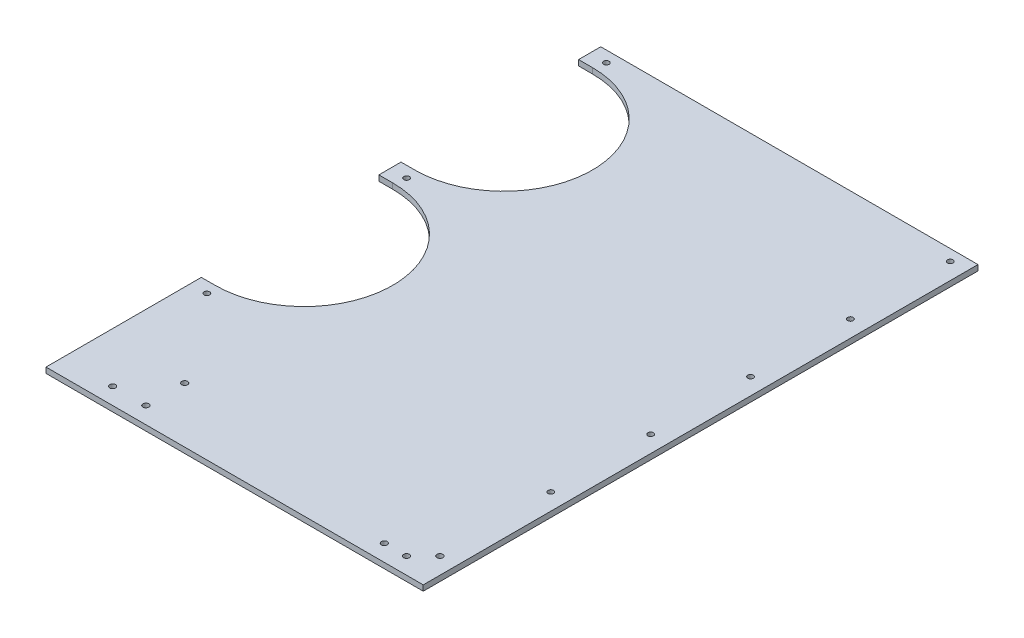
ISO-10303-21;
HEADER;
FILE_DESCRIPTION(('STEP AP214'),'2;1');
FILE_NAME('part.step','',(''),(''),'','','');
FILE_SCHEMA(('AUTOMOTIVE_DESIGN { 1 0 10303 214 1 1 1 1 }'));
ENDSEC;
DATA;
#1=APPLICATION_CONTEXT('core data for automotive mechanical design processes');
#2=APPLICATION_PROTOCOL_DEFINITION('international standard','automotive_design',2000,#1);
#3=PRODUCT_CONTEXT('',#1,'mechanical');
#4=PRODUCT('Part','Part','',(#3));
#5=PRODUCT_RELATED_PRODUCT_CATEGORY('part','',(#4));
#6=PRODUCT_DEFINITION_FORMATION('','',#4);
#7=PRODUCT_DEFINITION_CONTEXT('part definition',#1,'design');
#8=PRODUCT_DEFINITION('design','',#6,#7);
#9=PRODUCT_DEFINITION_SHAPE('','',#8);
#10=(LENGTH_UNIT() NAMED_UNIT(*) SI_UNIT(.MILLI.,.METRE.));
#11=(NAMED_UNIT(*) PLANE_ANGLE_UNIT() SI_UNIT($,.RADIAN.));
#12=(NAMED_UNIT(*) SI_UNIT($,.STERADIAN.) SOLID_ANGLE_UNIT());
#13=UNCERTAINTY_MEASURE_WITH_UNIT(LENGTH_MEASURE(1.E-05),#10,'distance_accuracy_value','');
#14=(GEOMETRIC_REPRESENTATION_CONTEXT(3) GLOBAL_UNCERTAINTY_ASSIGNED_CONTEXT((#13)) GLOBAL_UNIT_ASSIGNED_CONTEXT((#10,
#11,#12)) REPRESENTATION_CONTEXT('',''));
#15=CARTESIAN_POINT('',(0.,0.,0.));
#16=DIRECTION('',(0.,0.,1.));
#17=DIRECTION('',(1.,0.,0.));
#18=AXIS2_PLACEMENT_3D('',#15,#16,#17);
#19=CARTESIAN_POINT('',(-120.649999995191,-761.580050525437,374.650000000872));
#20=DIRECTION('',(0.,1.,0.));
#21=DIRECTION('',(1.,0.,0.));
#22=AXIS2_PLACEMENT_3D('',#19,#20,#21);
#23=CYLINDRICAL_SURFACE('',#22,3.3782);
#24=CARTESIAN_POINT('',(-120.649999995191,0.,374.650000000872));
#25=DIRECTION('',(0.,1.,0.));
#26=DIRECTION('',(1.,0.,0.));
#27=AXIS2_PLACEMENT_3D('',#24,#25,#26);
#28=CIRCLE('',#27,3.3782);
#29=CARTESIAN_POINT('',(-117.271799995191,0.,374.650000000872));
#30=VERTEX_POINT('',#29);
#31=EDGE_CURVE('E273',#30,#30,#28,.T.);
#32=ORIENTED_EDGE('',*,*,#31,.F.);
#33=EDGE_LOOP('',(#32));
#34=FACE_BOUND('',#33,.T.);
#35=CARTESIAN_POINT('',(-120.649999995191,6.35000000000005,374.650000000872));
#36=DIRECTION('',(0.,-1.,0.));
#37=DIRECTION('',(0.,0.,-1.));
#38=AXIS2_PLACEMENT_3D('',#35,#36,#37);
#39=CIRCLE('',#38,3.3782);
#40=CARTESIAN_POINT('',(-120.649999995191,6.35000000000005,371.271800000872));
#41=VERTEX_POINT('',#40);
#42=EDGE_CURVE('E209',#41,#41,#39,.T.);
#43=ORIENTED_EDGE('',*,*,#42,.F.);
#44=EDGE_LOOP('',(#43));
#45=FACE_BOUND('',#44,.T.);
#46=ADVANCED_FACE('F16',(#34,#45),#23,.F.);
#47=CARTESIAN_POINT('',(-120.649999995512,-761.580050525437,330.200000000874));
#48=DIRECTION('',(0.,1.,0.));
#49=DIRECTION('',(1.,0.,0.));
#50=AXIS2_PLACEMENT_3D('',#47,#48,#49);
#51=CYLINDRICAL_SURFACE('',#50,3.3782);
#52=CARTESIAN_POINT('',(-120.649999995512,0.,330.200000000874));
#53=DIRECTION('',(0.,1.,0.));
#54=DIRECTION('',(1.,0.,0.));
#55=AXIS2_PLACEMENT_3D('',#52,#53,#54);
#56=CIRCLE('',#55,3.3782);
#57=CARTESIAN_POINT('',(-117.271799995512,0.,330.200000000874));
#58=VERTEX_POINT('',#57);
#59=EDGE_CURVE('E531',#58,#58,#56,.T.);
#60=ORIENTED_EDGE('',*,*,#59,.F.);
#61=EDGE_LOOP('',(#60));
#62=FACE_BOUND('',#61,.T.);
#63=CARTESIAN_POINT('',(-120.649999995512,6.35000000000005,330.200000000874));
#64=DIRECTION('',(0.,-1.,0.));
#65=DIRECTION('',(0.,0.,-1.));
#66=AXIS2_PLACEMENT_3D('',#63,#64,#65);
#67=CIRCLE('',#66,3.3782);
#68=CARTESIAN_POINT('',(-120.649999995512,6.35000000000005,326.821800000874));
#69=VERTEX_POINT('',#68);
#70=EDGE_CURVE('E499',#69,#69,#67,.T.);
#71=ORIENTED_EDGE('',*,*,#70,.F.);
#72=EDGE_LOOP('',(#71));
#73=FACE_BOUND('',#72,.T.);
#74=ADVANCED_FACE('F297',(#62,#73),#51,.F.);
#75=CARTESIAN_POINT('',(-158.749999995189,-761.580050525437,374.650000001147));
#76=DIRECTION('',(0.,1.,0.));
#77=DIRECTION('',(1.,0.,0.));
#78=AXIS2_PLACEMENT_3D('',#75,#76,#77);
#79=CYLINDRICAL_SURFACE('',#78,3.3782);
#80=CARTESIAN_POINT('',(-158.749999995189,0.,374.650000001147));
#81=DIRECTION('',(0.,1.,0.));
#82=DIRECTION('',(1.,0.,0.));
#83=AXIS2_PLACEMENT_3D('',#80,#81,#82);
#84=CIRCLE('',#83,3.3782);
#85=CARTESIAN_POINT('',(-155.371799995189,0.,374.650000001147));
#86=VERTEX_POINT('',#85);
#87=EDGE_CURVE('E527',#86,#86,#84,.T.);
#88=ORIENTED_EDGE('',*,*,#87,.F.);
#89=EDGE_LOOP('',(#88));
#90=FACE_BOUND('',#89,.T.);
#91=CARTESIAN_POINT('',(-158.749999995189,6.35000000000005,374.650000001147));
#92=DIRECTION('',(0.,-1.,0.));
#93=DIRECTION('',(0.,0.,-1.));
#94=AXIS2_PLACEMENT_3D('',#91,#92,#93);
#95=CIRCLE('',#94,3.3782);
#96=CARTESIAN_POINT('',(-158.749999995189,6.35000000000005,371.271800001147));
#97=VERTEX_POINT('',#96);
#98=EDGE_CURVE('E503',#97,#97,#95,.T.);
#99=ORIENTED_EDGE('',*,*,#98,.F.);
#100=EDGE_LOOP('',(#99));
#101=FACE_BOUND('',#100,.T.);
#102=ADVANCED_FACE('F303',(#90,#101),#79,.F.);
#103=CARTESIAN_POINT('',(196.850000004656,-761.580050525437,355.599999998581));
#104=DIRECTION('',(0.,1.,0.));
#105=DIRECTION('',(1.,0.,0.));
#106=AXIS2_PLACEMENT_3D('',#103,#104,#105);
#107=CYLINDRICAL_SURFACE('',#106,3.3782);
#108=CARTESIAN_POINT('',(196.850000004656,0.,355.599999998581));
#109=DIRECTION('',(0.,1.,0.));
#110=DIRECTION('',(1.,0.,0.));
#111=AXIS2_PLACEMENT_3D('',#108,#109,#110);
#112=CIRCLE('',#111,3.3782);
#113=CARTESIAN_POINT('',(200.228200004656,0.,355.599999998581));
#114=VERTEX_POINT('',#113);
#115=EDGE_CURVE('E523',#114,#114,#112,.T.);
#116=ORIENTED_EDGE('',*,*,#115,.F.);
#117=EDGE_LOOP('',(#116));
#118=FACE_BOUND('',#117,.T.);
#119=CARTESIAN_POINT('',(196.850000004656,6.35000000000005,355.599999998581));
#120=DIRECTION('',(0.,-1.,0.));
#121=DIRECTION('',(0.,0.,-1.));
#122=AXIS2_PLACEMENT_3D('',#119,#120,#121);
#123=CIRCLE('',#122,3.3782);
#124=CARTESIAN_POINT('',(196.850000004656,6.35000000000005,352.221799998581));
#125=VERTEX_POINT('',#124);
#126=EDGE_CURVE('E507',#125,#125,#123,.T.);
#127=ORIENTED_EDGE('',*,*,#126,.F.);
#128=EDGE_LOOP('',(#127));
#129=FACE_BOUND('',#128,.T.);
#130=ADVANCED_FACE('F311',(#118,#129),#107,.F.);
#131=CARTESIAN_POINT('',(177.800000004794,-761.580050525437,374.649999998718));
#132=DIRECTION('',(0.,1.,0.));
#133=DIRECTION('',(1.,0.,0.));
#134=AXIS2_PLACEMENT_3D('',#131,#132,#133);
#135=CYLINDRICAL_SURFACE('',#134,3.3782);
#136=CARTESIAN_POINT('',(177.800000004794,0.,374.649999998718));
#137=DIRECTION('',(0.,1.,0.));
#138=DIRECTION('',(1.,0.,0.));
#139=AXIS2_PLACEMENT_3D('',#136,#137,#138);
#140=CIRCLE('',#139,3.3782);
#141=CARTESIAN_POINT('',(181.178200004794,0.,374.649999998718));
#142=VERTEX_POINT('',#141);
#143=EDGE_CURVE('E519',#142,#142,#140,.T.);
#144=ORIENTED_EDGE('',*,*,#143,.F.);
#145=EDGE_LOOP('',(#144));
#146=FACE_BOUND('',#145,.T.);
#147=CARTESIAN_POINT('',(177.800000004794,6.35000000000005,374.649999998718));
#148=DIRECTION('',(0.,-1.,0.));
#149=DIRECTION('',(0.,0.,-1.));
#150=AXIS2_PLACEMENT_3D('',#147,#148,#149);
#151=CIRCLE('',#150,3.3782);
#152=CARTESIAN_POINT('',(177.800000004794,6.35000000000005,371.271799998718));
#153=VERTEX_POINT('',#152);
#154=EDGE_CURVE('E511',#153,#153,#151,.T.);
#155=ORIENTED_EDGE('',*,*,#154,.F.);
#156=EDGE_LOOP('',(#155));
#157=FACE_BOUND('',#156,.T.);
#158=ADVANCED_FACE('F315',(#146,#157),#135,.F.);
#159=CARTESIAN_POINT('',(152.400000004795,-761.580050525437,374.649999998901));
#160=DIRECTION('',(0.,1.,0.));
#161=DIRECTION('',(1.,0.,0.));
#162=AXIS2_PLACEMENT_3D('',#159,#160,#161);
#163=CYLINDRICAL_SURFACE('',#162,3.3782);
#164=CARTESIAN_POINT('',(152.400000004795,0.,374.649999998901));
#165=DIRECTION('',(0.,1.,0.));
#166=DIRECTION('',(1.,0.,0.));
#167=AXIS2_PLACEMENT_3D('',#164,#165,#166);
#168=CIRCLE('',#167,3.3782);
#169=CARTESIAN_POINT('',(155.778200004795,0.,374.649999998901));
#170=VERTEX_POINT('',#169);
#171=EDGE_CURVE('E281',#170,#170,#168,.T.);
#172=ORIENTED_EDGE('',*,*,#171,.F.);
#173=EDGE_LOOP('',(#172));
#174=FACE_BOUND('',#173,.T.);
#175=CARTESIAN_POINT('',(152.400000004795,6.35000000000005,374.649999998901));
#176=DIRECTION('',(0.,-1.,0.));
#177=DIRECTION('',(0.,0.,-1.));
#178=AXIS2_PLACEMENT_3D('',#175,#176,#177);
#179=CIRCLE('',#178,3.3782);
#180=CARTESIAN_POINT('',(152.400000004795,6.35000000000005,371.271799998901));
#181=VERTEX_POINT('',#180);
#182=EDGE_CURVE('E244',#181,#181,#179,.T.);
#183=ORIENTED_EDGE('',*,*,#182,.F.);
#184=EDGE_LOOP('',(#183));
#185=FACE_BOUND('',#184,.T.);
#186=ADVANCED_FACE('F319',(#174,#185),#163,.F.);
#187=CARTESIAN_POINT('',(0.,3.175,393.7));
#188=DIRECTION('',(0.,0.,1.));
#189=DIRECTION('',(1.,0.,0.));
#190=AXIS2_PLACEMENT_3D('',#187,#188,#189);
#191=PLANE('',#190);
#192=DIRECTION('',(-1.,0.,0.));
#193=VECTOR('',#192,1.);
#194=CARTESIAN_POINT('',(215.9,6.35,393.7));
#195=LINE('',#194,#193);
#196=CARTESIAN_POINT('',(215.9,6.35,393.7));
#197=VERTEX_POINT('',#196);
#198=CARTESIAN_POINT('',(-215.9,6.35,393.7));
#199=VERTEX_POINT('',#198);
#200=EDGE_CURVE('E11',#197,#199,#195,.T.);
#201=ORIENTED_EDGE('',*,*,#200,.T.);
#202=DIRECTION('',(0.,-1.,0.));
#203=VECTOR('',#202,1.);
#204=CARTESIAN_POINT('',(-215.9,6.35,393.7));
#205=LINE('',#204,#203);
#206=CARTESIAN_POINT('',(-215.9,0.,393.7));
#207=VERTEX_POINT('',#206);
#208=EDGE_CURVE('E26',#199,#207,#205,.T.);
#209=ORIENTED_EDGE('',*,*,#208,.T.);
#210=DIRECTION('',(1.,0.,0.));
#211=VECTOR('',#210,1.);
#212=CARTESIAN_POINT('',(-215.9,0.,393.7));
#213=LINE('',#212,#211);
#214=CARTESIAN_POINT('',(215.9,0.,393.7));
#215=VERTEX_POINT('',#214);
#216=EDGE_CURVE('E267',#207,#215,#213,.T.);
#217=ORIENTED_EDGE('',*,*,#216,.T.);
#218=DIRECTION('',(0.,1.,0.));
#219=VECTOR('',#218,1.);
#220=CARTESIAN_POINT('',(215.9,0.,393.7));
#221=LINE('',#220,#219);
#222=EDGE_CURVE('E271',#215,#197,#221,.T.);
#223=ORIENTED_EDGE('',*,*,#222,.T.);
#224=EDGE_LOOP('',(#201,#209,#217,#223));
#225=FACE_BOUND('',#224,.T.);
#226=ADVANCED_FACE('F275',(#225),#191,.T.);
#227=CARTESIAN_POINT('',(0.,0.,0.));
#228=DIRECTION('',(0.,1.,0.));
#229=DIRECTION('',(0.,0.,1.));
#230=AXIS2_PLACEMENT_3D('',#227,#228,#229);
#231=PLANE('',#230);
#232=ORIENTED_EDGE('',*,*,#31,.T.);
#233=EDGE_LOOP('',(#232));
#234=FACE_BOUND('',#233,.T.);
#235=ORIENTED_EDGE('',*,*,#59,.T.);
#236=EDGE_LOOP('',(#235));
#237=FACE_BOUND('',#236,.T.);
#238=ORIENTED_EDGE('',*,*,#87,.T.);
#239=EDGE_LOOP('',(#238));
#240=FACE_BOUND('',#239,.T.);
#241=ORIENTED_EDGE('',*,*,#115,.T.);
#242=EDGE_LOOP('',(#241));
#243=FACE_BOUND('',#242,.T.);
#244=ORIENTED_EDGE('',*,*,#143,.T.);
#245=EDGE_LOOP('',(#244));
#246=FACE_BOUND('',#245,.T.);
#247=ORIENTED_EDGE('',*,*,#171,.T.);
#248=EDGE_LOOP('',(#247));
#249=FACE_BOUND('',#248,.T.);
#250=DIRECTION('',(0.,0.,-1.));
#251=VECTOR('',#250,1.);
#252=CARTESIAN_POINT('',(-215.9,0.,279.4));
#253=LINE('',#252,#251);
#254=CARTESIAN_POINT('',(-215.9,0.,215.9));
#255=VERTEX_POINT('',#254);
#256=EDGE_CURVE('E279',#207,#255,#253,.T.);
#257=ORIENTED_EDGE('',*,*,#256,.T.);
#258=DIRECTION('',(1.,0.,0.));
#259=VECTOR('',#258,1.);
#260=CARTESIAN_POINT('',(-100.0125,0.,215.9));
#261=LINE('',#260,#259);
#262=CARTESIAN_POINT('',(-200.025,0.,215.9));
#263=VERTEX_POINT('',#262);
#264=EDGE_CURVE('E282',#255,#263,#261,.T.);
#265=ORIENTED_EDGE('',*,*,#264,.T.);
#266=CARTESIAN_POINT('',(-200.025,0.,114.3));
#267=DIRECTION('',(0.,1.,0.));
#268=DIRECTION('',(1.,0.,0.));
#269=AXIS2_PLACEMENT_3D('',#266,#267,#268);
#270=CIRCLE('',#269,101.6);
#271=CARTESIAN_POINT('',(-200.025,0.,12.7));
#272=VERTEX_POINT('',#271);
#273=EDGE_CURVE('E126',#263,#272,#270,.T.);
#274=ORIENTED_EDGE('',*,*,#273,.T.);
#275=DIRECTION('',(-1.,0.,0.));
#276=VECTOR('',#275,1.);
#277=CARTESIAN_POINT('',(-107.95,0.,12.7));
#278=LINE('',#277,#276);
#279=CARTESIAN_POINT('',(-215.9,0.,12.7));
#280=VERTEX_POINT('',#279);
#281=EDGE_CURVE('E168',#272,#280,#278,.T.);
#282=ORIENTED_EDGE('',*,*,#281,.T.);
#283=DIRECTION('',(0.,0.,-1.));
#284=VECTOR('',#283,1.);
#285=CARTESIAN_POINT('',(-215.9,0.,279.4));
#286=LINE('',#285,#284);
#287=CARTESIAN_POINT('',(-215.9,0.,-12.7));
#288=VERTEX_POINT('',#287);
#289=EDGE_CURVE('E165',#280,#288,#286,.T.);
#290=ORIENTED_EDGE('',*,*,#289,.T.);
#291=DIRECTION('',(1.,0.,0.));
#292=VECTOR('',#291,1.);
#293=CARTESIAN_POINT('',(-100.0125,0.,-12.7));
#294=LINE('',#293,#292);
#295=CARTESIAN_POINT('',(-200.025,0.,-12.7));
#296=VERTEX_POINT('',#295);
#297=EDGE_CURVE('E146',#288,#296,#294,.T.);
#298=ORIENTED_EDGE('',*,*,#297,.T.);
#299=CARTESIAN_POINT('',(-200.025,0.,-114.3));
#300=DIRECTION('',(0.,1.,0.));
#301=DIRECTION('',(1.,0.,0.));
#302=AXIS2_PLACEMENT_3D('',#299,#300,#301);
#303=CIRCLE('',#302,101.6);
#304=CARTESIAN_POINT('',(-200.025,0.,-215.9));
#305=VERTEX_POINT('',#304);
#306=EDGE_CURVE('E155',#296,#305,#303,.T.);
#307=ORIENTED_EDGE('',*,*,#306,.T.);
#308=DIRECTION('',(-1.,0.,0.));
#309=VECTOR('',#308,1.);
#310=CARTESIAN_POINT('',(-107.95,0.,-215.9));
#311=LINE('',#310,#309);
#312=CARTESIAN_POINT('',(-215.9,0.,-215.9));
#313=VERTEX_POINT('',#312);
#314=EDGE_CURVE('E159',#305,#313,#311,.T.);
#315=ORIENTED_EDGE('',*,*,#314,.T.);
#316=DIRECTION('',(0.,0.,-1.));
#317=VECTOR('',#316,1.);
#318=CARTESIAN_POINT('',(-215.9,0.,279.4));
#319=LINE('',#318,#317);
#320=CARTESIAN_POINT('',(-215.9,0.,-241.3));
#321=VERTEX_POINT('',#320);
#322=EDGE_CURVE('E173',#313,#321,#319,.T.);
#323=ORIENTED_EDGE('',*,*,#322,.T.);
#324=DIRECTION('',(1.,0.,0.));
#325=VECTOR('',#324,1.);
#326=CARTESIAN_POINT('',(107.95,0.,-241.3));
#327=LINE('',#326,#325);
#328=CARTESIAN_POINT('',(215.9,0.,-241.3));
#329=VERTEX_POINT('',#328);
#330=EDGE_CURVE('E176',#321,#329,#327,.T.);
#331=ORIENTED_EDGE('',*,*,#330,.T.);
#332=DIRECTION('',(0.,0.,1.));
#333=VECTOR('',#332,1.);
#334=CARTESIAN_POINT('',(215.9,0.,-279.4));
#335=LINE('',#334,#333);
#336=EDGE_CURVE('E179',#329,#215,#335,.T.);
#337=ORIENTED_EDGE('',*,*,#336,.T.);
#338=ORIENTED_EDGE('',*,*,#216,.F.);
#339=EDGE_LOOP('',(#257,#265,#274,#282,#290,#298,#307,#315,#323,#331,#337,#338));
#340=FACE_BOUND('',#339,.T.);
#341=CARTESIAN_POINT('',(-196.85,0.,-228.6));
#342=DIRECTION('',(0.,1.,0.));
#343=DIRECTION('',(1.,0.,0.));
#344=AXIS2_PLACEMENT_3D('',#341,#342,#343);
#345=CIRCLE('',#344,3.175);
#346=CARTESIAN_POINT('',(-193.675,0.,-228.6));
#347=VERTEX_POINT('',#346);
#348=EDGE_CURVE('E182',#347,#347,#345,.T.);
#349=ORIENTED_EDGE('',*,*,#348,.T.);
#350=EDGE_LOOP('',(#349));
#351=FACE_BOUND('',#350,.T.);
#352=CARTESIAN_POINT('',(-196.85,0.,228.6));
#353=DIRECTION('',(0.,1.,0.));
#354=DIRECTION('',(1.,0.,0.));
#355=AXIS2_PLACEMENT_3D('',#352,#353,#354);
#356=CIRCLE('',#355,3.175);
#357=CARTESIAN_POINT('',(-193.675,0.,228.6));
#358=VERTEX_POINT('',#357);
#359=EDGE_CURVE('E185',#358,#358,#356,.T.);
#360=ORIENTED_EDGE('',*,*,#359,.T.);
#361=EDGE_LOOP('',(#360));
#362=FACE_BOUND('',#361,.T.);
#363=CARTESIAN_POINT('',(-196.85,0.,0.));
#364=DIRECTION('',(0.,1.,0.));
#365=DIRECTION('',(1.,0.,0.));
#366=AXIS2_PLACEMENT_3D('',#363,#364,#365);
#367=CIRCLE('',#366,3.175);
#368=CARTESIAN_POINT('',(-193.675,0.,0.));
#369=VERTEX_POINT('',#368);
#370=EDGE_CURVE('E188',#369,#369,#367,.T.);
#371=ORIENTED_EDGE('',*,*,#370,.T.);
#372=EDGE_LOOP('',(#371));
#373=FACE_BOUND('',#372,.T.);
#374=CARTESIAN_POINT('',(196.85,0.,-114.3));
#375=DIRECTION('',(0.,1.,0.));
#376=DIRECTION('',(1.,0.,0.));
#377=AXIS2_PLACEMENT_3D('',#374,#375,#376);
#378=CIRCLE('',#377,3.175);
#379=CARTESIAN_POINT('',(200.025,0.,-114.3));
#380=VERTEX_POINT('',#379);
#381=EDGE_CURVE('E191',#380,#380,#378,.T.);
#382=ORIENTED_EDGE('',*,*,#381,.T.);
#383=EDGE_LOOP('',(#382));
#384=FACE_BOUND('',#383,.T.);
#385=CARTESIAN_POINT('',(196.85,0.,228.6));
#386=DIRECTION('',(0.,1.,0.));
#387=DIRECTION('',(1.,0.,0.));
#388=AXIS2_PLACEMENT_3D('',#385,#386,#387);
#389=CIRCLE('',#388,3.175);
#390=CARTESIAN_POINT('',(200.025,0.,228.6));
#391=VERTEX_POINT('',#390);
#392=EDGE_CURVE('E194',#391,#391,#389,.T.);
#393=ORIENTED_EDGE('',*,*,#392,.T.);
#394=EDGE_LOOP('',(#393));
#395=FACE_BOUND('',#394,.T.);
#396=CARTESIAN_POINT('',(196.85,0.,-228.6));
#397=DIRECTION('',(0.,1.,0.));
#398=DIRECTION('',(1.,0.,0.));
#399=AXIS2_PLACEMENT_3D('',#396,#397,#398);
#400=CIRCLE('',#399,3.175);
#401=CARTESIAN_POINT('',(200.025,0.,-228.6));
#402=VERTEX_POINT('',#401);
#403=EDGE_CURVE('E197',#402,#402,#400,.T.);
#404=ORIENTED_EDGE('',*,*,#403,.T.);
#405=EDGE_LOOP('',(#404));
#406=FACE_BOUND('',#405,.T.);
#407=CARTESIAN_POINT('',(196.85,0.,0.));
#408=DIRECTION('',(0.,1.,0.));
#409=DIRECTION('',(1.,0.,0.));
#410=AXIS2_PLACEMENT_3D('',#407,#408,#409);
#411=CIRCLE('',#410,3.175);
#412=CARTESIAN_POINT('',(200.025,0.,0.));
#413=VERTEX_POINT('',#412);
#414=EDGE_CURVE('E200',#413,#413,#411,.T.);
#415=ORIENTED_EDGE('',*,*,#414,.T.);
#416=EDGE_LOOP('',(#415));
#417=FACE_BOUND('',#416,.T.);
#418=CARTESIAN_POINT('',(196.85,0.,114.3));
#419=DIRECTION('',(0.,1.,0.));
#420=DIRECTION('',(1.,0.,0.));
#421=AXIS2_PLACEMENT_3D('',#418,#419,#420);
#422=CIRCLE('',#421,3.175);
#423=CARTESIAN_POINT('',(200.025,0.,114.3));
#424=VERTEX_POINT('',#423);
#425=EDGE_CURVE('E203',#424,#424,#422,.T.);
#426=ORIENTED_EDGE('',*,*,#425,.T.);
#427=EDGE_LOOP('',(#426));
#428=FACE_BOUND('',#427,.T.);
#429=ADVANCED_FACE('F162',(#234,#237,#240,#243,#246,#249,#340,#351,#362,#373,#384,#395,#406,
#417,#428),#231,.F.);
#430=CARTESIAN_POINT('',(-215.9,0.,-279.4));
#431=DIRECTION('',(-1.,0.,0.));
#432=DIRECTION('',(0.,0.,1.));
#433=AXIS2_PLACEMENT_3D('',#430,#431,#432);
#434=PLANE('',#433);
#435=DIRECTION('',(0.,0.,1.));
#436=VECTOR('',#435,1.);
#437=CARTESIAN_POINT('',(-215.9,6.35,368.3));
#438=LINE('',#437,#436);
#439=CARTESIAN_POINT('',(-215.9,6.35,215.9));
#440=VERTEX_POINT('',#439);
#441=EDGE_CURVE('E115',#440,#199,#438,.T.);
#442=ORIENTED_EDGE('',*,*,#441,.F.);
#443=DIRECTION('',(0.,-1.,0.));
#444=VECTOR('',#443,1.);
#445=CARTESIAN_POINT('',(-215.9,3.175,215.9));
#446=LINE('',#445,#444);
#447=EDGE_CURVE('E112',#440,#255,#446,.T.);
#448=ORIENTED_EDGE('',*,*,#447,.T.);
#449=ORIENTED_EDGE('',*,*,#256,.F.);
#450=ORIENTED_EDGE('',*,*,#208,.F.);
#451=EDGE_LOOP('',(#442,#448,#449,#450));
#452=FACE_BOUND('',#451,.T.);
#453=ADVANCED_FACE('F328',(#452),#434,.T.);
#454=CARTESIAN_POINT('',(196.85,-641.256610914373,114.3));
#455=DIRECTION('',(0.,1.,0.));
#456=DIRECTION('',(1.,0.,0.));
#457=AXIS2_PLACEMENT_3D('',#454,#455,#456);
#458=CYLINDRICAL_SURFACE('',#457,3.175);
#459=ORIENTED_EDGE('',*,*,#425,.F.);
#460=EDGE_LOOP('',(#459));
#461=FACE_BOUND('',#460,.T.);
#462=CARTESIAN_POINT('',(196.85,6.35000000000005,114.3));
#463=DIRECTION('',(0.,-1.,0.));
#464=DIRECTION('',(0.,0.,-1.));
#465=AXIS2_PLACEMENT_3D('',#462,#463,#464);
#466=CIRCLE('',#465,3.175);
#467=CARTESIAN_POINT('',(196.85,6.35000000000005,111.125));
#468=VERTEX_POINT('',#467);
#469=EDGE_CURVE('E207',#468,#468,#466,.T.);
#470=ORIENTED_EDGE('',*,*,#469,.F.);
#471=EDGE_LOOP('',(#470));
#472=FACE_BOUND('',#471,.T.);
#473=ADVANCED_FACE('F332',(#461,#472),#458,.F.);
#474=CARTESIAN_POINT('',(196.85,-641.256610914373,0.));
#475=DIRECTION('',(0.,1.,0.));
#476=DIRECTION('',(1.,0.,0.));
#477=AXIS2_PLACEMENT_3D('',#474,#475,#476);
#478=CYLINDRICAL_SURFACE('',#477,3.175);
#479=ORIENTED_EDGE('',*,*,#414,.F.);
#480=EDGE_LOOP('',(#479));
#481=FACE_BOUND('',#480,.T.);
#482=CARTESIAN_POINT('',(196.85,6.35000000000005,0.));
#483=DIRECTION('',(0.,-1.,0.));
#484=DIRECTION('',(0.,0.,-1.));
#485=AXIS2_PLACEMENT_3D('',#482,#483,#484);
#486=CIRCLE('',#485,3.175);
#487=CARTESIAN_POINT('',(196.85,6.35000000000005,-3.175));
#488=VERTEX_POINT('',#487);
#489=EDGE_CURVE('E212',#488,#488,#486,.T.);
#490=ORIENTED_EDGE('',*,*,#489,.F.);
#491=EDGE_LOOP('',(#490));
#492=FACE_BOUND('',#491,.T.);
#493=ADVANCED_FACE('F335',(#481,#492),#478,.F.);
#494=CARTESIAN_POINT('',(196.85,-641.256610914373,-228.6));
#495=DIRECTION('',(0.,1.,0.));
#496=DIRECTION('',(1.,0.,0.));
#497=AXIS2_PLACEMENT_3D('',#494,#495,#496);
#498=CYLINDRICAL_SURFACE('',#497,3.175);
#499=ORIENTED_EDGE('',*,*,#403,.F.);
#500=EDGE_LOOP('',(#499));
#501=FACE_BOUND('',#500,.T.);
#502=CARTESIAN_POINT('',(196.85,6.35000000000005,-228.6));
#503=DIRECTION('',(0.,-1.,0.));
#504=DIRECTION('',(0.,0.,-1.));
#505=AXIS2_PLACEMENT_3D('',#502,#503,#504);
#506=CIRCLE('',#505,3.175);
#507=CARTESIAN_POINT('',(196.85,6.35000000000005,-231.775));
#508=VERTEX_POINT('',#507);
#509=EDGE_CURVE('E215',#508,#508,#506,.T.);
#510=ORIENTED_EDGE('',*,*,#509,.F.);
#511=EDGE_LOOP('',(#510));
#512=FACE_BOUND('',#511,.T.);
#513=ADVANCED_FACE('F339',(#501,#512),#498,.F.);
#514=CARTESIAN_POINT('',(196.85,-641.256610914373,228.6));
#515=DIRECTION('',(0.,1.,0.));
#516=DIRECTION('',(1.,0.,0.));
#517=AXIS2_PLACEMENT_3D('',#514,#515,#516);
#518=CYLINDRICAL_SURFACE('',#517,3.175);
#519=ORIENTED_EDGE('',*,*,#392,.F.);
#520=EDGE_LOOP('',(#519));
#521=FACE_BOUND('',#520,.T.);
#522=CARTESIAN_POINT('',(196.85,6.35000000000005,228.6));
#523=DIRECTION('',(0.,-1.,0.));
#524=DIRECTION('',(0.,0.,-1.));
#525=AXIS2_PLACEMENT_3D('',#522,#523,#524);
#526=CIRCLE('',#525,3.175);
#527=CARTESIAN_POINT('',(196.85,6.35000000000005,225.425));
#528=VERTEX_POINT('',#527);
#529=EDGE_CURVE('E218',#528,#528,#526,.T.);
#530=ORIENTED_EDGE('',*,*,#529,.F.);
#531=EDGE_LOOP('',(#530));
#532=FACE_BOUND('',#531,.T.);
#533=ADVANCED_FACE('F343',(#521,#532),#518,.F.);
#534=CARTESIAN_POINT('',(196.85,-641.256610914373,-114.3));
#535=DIRECTION('',(0.,1.,0.));
#536=DIRECTION('',(1.,0.,0.));
#537=AXIS2_PLACEMENT_3D('',#534,#535,#536);
#538=CYLINDRICAL_SURFACE('',#537,3.175);
#539=ORIENTED_EDGE('',*,*,#381,.F.);
#540=EDGE_LOOP('',(#539));
#541=FACE_BOUND('',#540,.T.);
#542=CARTESIAN_POINT('',(196.85,6.35000000000005,-114.3));
#543=DIRECTION('',(0.,-1.,0.));
#544=DIRECTION('',(0.,0.,-1.));
#545=AXIS2_PLACEMENT_3D('',#542,#543,#544);
#546=CIRCLE('',#545,3.175);
#547=CARTESIAN_POINT('',(196.85,6.35000000000005,-117.475));
#548=VERTEX_POINT('',#547);
#549=EDGE_CURVE('E221',#548,#548,#546,.T.);
#550=ORIENTED_EDGE('',*,*,#549,.F.);
#551=EDGE_LOOP('',(#550));
#552=FACE_BOUND('',#551,.T.);
#553=ADVANCED_FACE('F347',(#541,#552),#538,.F.);
#554=CARTESIAN_POINT('',(-196.85,-641.256610914373,0.));
#555=DIRECTION('',(0.,1.,0.));
#556=DIRECTION('',(1.,0.,0.));
#557=AXIS2_PLACEMENT_3D('',#554,#555,#556);
#558=CYLINDRICAL_SURFACE('',#557,3.175);
#559=ORIENTED_EDGE('',*,*,#370,.F.);
#560=EDGE_LOOP('',(#559));
#561=FACE_BOUND('',#560,.T.);
#562=CARTESIAN_POINT('',(-196.85,6.35000000000005,0.));
#563=DIRECTION('',(0.,-1.,0.));
#564=DIRECTION('',(0.,0.,-1.));
#565=AXIS2_PLACEMENT_3D('',#562,#563,#564);
#566=CIRCLE('',#565,3.175);
#567=CARTESIAN_POINT('',(-196.85,6.35000000000005,-3.175));
#568=VERTEX_POINT('',#567);
#569=EDGE_CURVE('E224',#568,#568,#566,.T.);
#570=ORIENTED_EDGE('',*,*,#569,.F.);
#571=EDGE_LOOP('',(#570));
#572=FACE_BOUND('',#571,.T.);
#573=ADVANCED_FACE('F351',(#561,#572),#558,.F.);
#574=CARTESIAN_POINT('',(-196.85,-641.256610914373,228.6));
#575=DIRECTION('',(0.,1.,0.));
#576=DIRECTION('',(1.,0.,0.));
#577=AXIS2_PLACEMENT_3D('',#574,#575,#576);
#578=CYLINDRICAL_SURFACE('',#577,3.175);
#579=ORIENTED_EDGE('',*,*,#359,.F.);
#580=EDGE_LOOP('',(#579));
#581=FACE_BOUND('',#580,.T.);
#582=CARTESIAN_POINT('',(-196.85,6.35000000000005,228.6));
#583=DIRECTION('',(0.,-1.,0.));
#584=DIRECTION('',(0.,0.,-1.));
#585=AXIS2_PLACEMENT_3D('',#582,#583,#584);
#586=CIRCLE('',#585,3.175);
#587=CARTESIAN_POINT('',(-196.85,6.35000000000005,225.425));
#588=VERTEX_POINT('',#587);
#589=EDGE_CURVE('E227',#588,#588,#586,.T.);
#590=ORIENTED_EDGE('',*,*,#589,.F.);
#591=EDGE_LOOP('',(#590));
#592=FACE_BOUND('',#591,.T.);
#593=ADVANCED_FACE('F355',(#581,#592),#578,.F.);
#594=CARTESIAN_POINT('',(-196.85,-641.256610914373,-228.6));
#595=DIRECTION('',(0.,1.,0.));
#596=DIRECTION('',(1.,0.,0.));
#597=AXIS2_PLACEMENT_3D('',#594,#595,#596);
#598=CYLINDRICAL_SURFACE('',#597,3.175);
#599=ORIENTED_EDGE('',*,*,#348,.F.);
#600=EDGE_LOOP('',(#599));
#601=FACE_BOUND('',#600,.T.);
#602=CARTESIAN_POINT('',(-196.85,6.35000000000005,-228.6));
#603=DIRECTION('',(0.,-1.,0.));
#604=DIRECTION('',(0.,0.,-1.));
#605=AXIS2_PLACEMENT_3D('',#602,#603,#604);
#606=CIRCLE('',#605,3.175);
#607=CARTESIAN_POINT('',(-196.85,6.35000000000005,-231.775));
#608=VERTEX_POINT('',#607);
#609=EDGE_CURVE('E230',#608,#608,#606,.T.);
#610=ORIENTED_EDGE('',*,*,#609,.F.);
#611=EDGE_LOOP('',(#610));
#612=FACE_BOUND('',#611,.T.);
#613=ADVANCED_FACE('F359',(#601,#612),#598,.F.);
#614=CARTESIAN_POINT('',(215.9,6.35,-241.3));
#615=DIRECTION('',(0.,0.,1.));
#616=DIRECTION('',(1.,0.,0.));
#617=AXIS2_PLACEMENT_3D('',#614,#615,#616);
#618=PLANE('',#617);
#619=DIRECTION('',(-1.,0.,0.));
#620=VECTOR('',#619,1.);
#621=CARTESIAN_POINT('',(107.95,6.35,-241.3));
#622=LINE('',#621,#620);
#623=CARTESIAN_POINT('',(215.9,6.35,-241.3));
#624=VERTEX_POINT('',#623);
#625=CARTESIAN_POINT('',(-215.9,6.35,-241.3));
#626=VERTEX_POINT('',#625);
#627=EDGE_CURVE('E234',#624,#626,#622,.T.);
#628=ORIENTED_EDGE('',*,*,#627,.F.);
#629=DIRECTION('',(0.,1.,0.));
#630=VECTOR('',#629,1.);
#631=CARTESIAN_POINT('',(215.9,3.175,-241.3));
#632=LINE('',#631,#630);
#633=EDGE_CURVE('E131',#329,#624,#632,.T.);
#634=ORIENTED_EDGE('',*,*,#633,.F.);
#635=ORIENTED_EDGE('',*,*,#330,.F.);
#636=DIRECTION('',(0.,-1.,0.));
#637=VECTOR('',#636,1.);
#638=CARTESIAN_POINT('',(-215.9,3.175,-241.3));
#639=LINE('',#638,#637);
#640=EDGE_CURVE('E233',#626,#321,#639,.T.);
#641=ORIENTED_EDGE('',*,*,#640,.F.);
#642=EDGE_LOOP('',(#628,#634,#635,#641));
#643=FACE_BOUND('',#642,.T.);
#644=ADVANCED_FACE('F265',(#643),#618,.F.);
#645=CARTESIAN_POINT('',(0.,6.35,0.));
#646=DIRECTION('',(0.,1.,0.));
#647=DIRECTION('',(0.,0.,1.));
#648=AXIS2_PLACEMENT_3D('',#645,#646,#647);
#649=PLANE('',#648);
#650=ORIENTED_EDGE('',*,*,#42,.T.);
#651=EDGE_LOOP('',(#650));
#652=FACE_BOUND('',#651,.T.);
#653=ORIENTED_EDGE('',*,*,#70,.T.);
#654=EDGE_LOOP('',(#653));
#655=FACE_BOUND('',#654,.T.);
#656=ORIENTED_EDGE('',*,*,#98,.T.);
#657=EDGE_LOOP('',(#656));
#658=FACE_BOUND('',#657,.T.);
#659=ORIENTED_EDGE('',*,*,#126,.T.);
#660=EDGE_LOOP('',(#659));
#661=FACE_BOUND('',#660,.T.);
#662=ORIENTED_EDGE('',*,*,#154,.T.);
#663=EDGE_LOOP('',(#662));
#664=FACE_BOUND('',#663,.T.);
#665=ORIENTED_EDGE('',*,*,#182,.T.);
#666=EDGE_LOOP('',(#665));
#667=FACE_BOUND('',#666,.T.);
#668=DIRECTION('',(0.,0.,-1.));
#669=VECTOR('',#668,1.);
#670=CARTESIAN_POINT('',(215.9,6.35,-279.4));
#671=LINE('',#670,#669);
#672=EDGE_CURVE('E237',#197,#624,#671,.T.);
#673=ORIENTED_EDGE('',*,*,#672,.T.);
#674=ORIENTED_EDGE('',*,*,#627,.T.);
#675=DIRECTION('',(0.,0.,1.));
#676=VECTOR('',#675,1.);
#677=CARTESIAN_POINT('',(-215.9,6.35,279.4));
#678=LINE('',#677,#676);
#679=CARTESIAN_POINT('',(-215.9,6.35,-215.9));
#680=VERTEX_POINT('',#679);
#681=EDGE_CURVE('E238',#626,#680,#678,.T.);
#682=ORIENTED_EDGE('',*,*,#681,.T.);
#683=DIRECTION('',(1.,0.,0.));
#684=VECTOR('',#683,1.);
#685=CARTESIAN_POINT('',(-107.95,6.35,-215.9));
#686=LINE('',#685,#684);
#687=CARTESIAN_POINT('',(-200.025,6.35,-215.9));
#688=VERTEX_POINT('',#687);
#689=EDGE_CURVE('E247',#680,#688,#686,.T.);
#690=ORIENTED_EDGE('',*,*,#689,.T.);
#691=CARTESIAN_POINT('',(-200.025,6.35,-114.3));
#692=DIRECTION('',(0.,-1.,0.));
#693=DIRECTION('',(0.,0.,-1.));
#694=AXIS2_PLACEMENT_3D('',#691,#692,#693);
#695=CIRCLE('',#694,101.6);
#696=CARTESIAN_POINT('',(-200.025,6.35,-12.7));
#697=VERTEX_POINT('',#696);
#698=EDGE_CURVE('E152',#688,#697,#695,.T.);
#699=ORIENTED_EDGE('',*,*,#698,.T.);
#700=DIRECTION('',(-1.,0.,0.));
#701=VECTOR('',#700,1.);
#702=CARTESIAN_POINT('',(-100.0125,6.35,-12.7));
#703=LINE('',#702,#701);
#704=CARTESIAN_POINT('',(-215.9,6.35,-12.7));
#705=VERTEX_POINT('',#704);
#706=EDGE_CURVE('E149',#697,#705,#703,.T.);
#707=ORIENTED_EDGE('',*,*,#706,.T.);
#708=DIRECTION('',(0.,0.,1.));
#709=VECTOR('',#708,1.);
#710=CARTESIAN_POINT('',(-215.9,6.35,279.4));
#711=LINE('',#710,#709);
#712=CARTESIAN_POINT('',(-215.9,6.35,12.7));
#713=VERTEX_POINT('',#712);
#714=EDGE_CURVE('E251',#705,#713,#711,.T.);
#715=ORIENTED_EDGE('',*,*,#714,.T.);
#716=DIRECTION('',(1.,0.,0.));
#717=VECTOR('',#716,1.);
#718=CARTESIAN_POINT('',(-107.95,6.35,12.7));
#719=LINE('',#718,#717);
#720=CARTESIAN_POINT('',(-200.025,6.35,12.7));
#721=VERTEX_POINT('',#720);
#722=EDGE_CURVE('E121',#713,#721,#719,.T.);
#723=ORIENTED_EDGE('',*,*,#722,.T.);
#724=CARTESIAN_POINT('',(-200.025,6.35,114.3));
#725=DIRECTION('',(0.,-1.,0.));
#726=DIRECTION('',(0.,0.,-1.));
#727=AXIS2_PLACEMENT_3D('',#724,#725,#726);
#728=CIRCLE('',#727,101.6);
#729=CARTESIAN_POINT('',(-200.025,6.35,215.9));
#730=VERTEX_POINT('',#729);
#731=EDGE_CURVE('E101',#721,#730,#728,.T.);
#732=ORIENTED_EDGE('',*,*,#731,.T.);
#733=DIRECTION('',(-1.,0.,0.));
#734=VECTOR('',#733,1.);
#735=CARTESIAN_POINT('',(-100.0125,6.35,215.9));
#736=LINE('',#735,#734);
#737=EDGE_CURVE('E108',#730,#440,#736,.T.);
#738=ORIENTED_EDGE('',*,*,#737,.T.);
#739=ORIENTED_EDGE('',*,*,#441,.T.);
#740=ORIENTED_EDGE('',*,*,#200,.F.);
#741=EDGE_LOOP('',(#673,#674,#682,#690,#699,#707,#715,#723,#732,#738,#739,#740));
#742=FACE_BOUND('',#741,.T.);
#743=ORIENTED_EDGE('',*,*,#469,.T.);
#744=EDGE_LOOP('',(#743));
#745=FACE_BOUND('',#744,.T.);
#746=ORIENTED_EDGE('',*,*,#489,.T.);
#747=EDGE_LOOP('',(#746));
#748=FACE_BOUND('',#747,.T.);
#749=ORIENTED_EDGE('',*,*,#509,.T.);
#750=EDGE_LOOP('',(#749));
#751=FACE_BOUND('',#750,.T.);
#752=ORIENTED_EDGE('',*,*,#529,.T.);
#753=EDGE_LOOP('',(#752));
#754=FACE_BOUND('',#753,.T.);
#755=ORIENTED_EDGE('',*,*,#549,.T.);
#756=EDGE_LOOP('',(#755));
#757=FACE_BOUND('',#756,.T.);
#758=ORIENTED_EDGE('',*,*,#569,.T.);
#759=EDGE_LOOP('',(#758));
#760=FACE_BOUND('',#759,.T.);
#761=ORIENTED_EDGE('',*,*,#589,.T.);
#762=EDGE_LOOP('',(#761));
#763=FACE_BOUND('',#762,.T.);
#764=ORIENTED_EDGE('',*,*,#609,.T.);
#765=EDGE_LOOP('',(#764));
#766=FACE_BOUND('',#765,.T.);
#767=ADVANCED_FACE('F118',(#652,#655,#658,#661,#664,#667,#742,#745,#748,#751,#754,#757,#760,
#763,#766),#649,.T.);
#768=CARTESIAN_POINT('',(-215.9,0.,-279.4));
#769=DIRECTION('',(-1.,0.,0.));
#770=DIRECTION('',(0.,0.,1.));
#771=AXIS2_PLACEMENT_3D('',#768,#769,#770);
#772=PLANE('',#771);
#773=ORIENTED_EDGE('',*,*,#640,.T.);
#774=ORIENTED_EDGE('',*,*,#322,.F.);
#775=DIRECTION('',(0.,1.,0.));
#776=VECTOR('',#775,1.);
#777=CARTESIAN_POINT('',(-215.9,3.175,-215.9));
#778=LINE('',#777,#776);
#779=EDGE_CURVE('E240',#313,#680,#778,.T.);
#780=ORIENTED_EDGE('',*,*,#779,.T.);
#781=ORIENTED_EDGE('',*,*,#681,.F.);
#782=EDGE_LOOP('',(#773,#774,#780,#781));
#783=FACE_BOUND('',#782,.T.);
#784=ADVANCED_FACE('F257',(#783),#772,.T.);
#785=CARTESIAN_POINT('',(215.9,0.,279.4));
#786=DIRECTION('',(1.,0.,0.));
#787=DIRECTION('',(0.,0.,-1.));
#788=AXIS2_PLACEMENT_3D('',#785,#786,#787);
#789=PLANE('',#788);
#790=ORIENTED_EDGE('',*,*,#336,.F.);
#791=ORIENTED_EDGE('',*,*,#633,.T.);
#792=ORIENTED_EDGE('',*,*,#672,.F.);
#793=ORIENTED_EDGE('',*,*,#222,.F.);
#794=EDGE_LOOP('',(#790,#791,#792,#793));
#795=FACE_BOUND('',#794,.T.);
#796=ADVANCED_FACE('F269',(#795),#789,.T.);
#797=CARTESIAN_POINT('',(-200.025,6.35,114.3));
#798=DIRECTION('',(0.,-1.,0.));
#799=DIRECTION('',(0.,0.,-1.));
#800=AXIS2_PLACEMENT_3D('',#797,#798,#799);
#801=CYLINDRICAL_SURFACE('',#800,101.6);
#802=ORIENTED_EDGE('',*,*,#731,.F.);
#803=DIRECTION('',(0.,-1.,0.));
#804=VECTOR('',#803,1.);
#805=CARTESIAN_POINT('',(-200.025,6.35,12.7));
#806=LINE('',#805,#804);
#807=EDGE_CURVE('E128',#721,#272,#806,.T.);
#808=ORIENTED_EDGE('',*,*,#807,.T.);
#809=ORIENTED_EDGE('',*,*,#273,.F.);
#810=DIRECTION('',(0.,-1.,0.));
#811=VECTOR('',#810,1.);
#812=CARTESIAN_POINT('',(-200.025,6.35,215.9));
#813=LINE('',#812,#811);
#814=EDGE_CURVE('E110',#730,#263,#813,.T.);
#815=ORIENTED_EDGE('',*,*,#814,.F.);
#816=EDGE_LOOP('',(#802,#808,#809,#815));
#817=FACE_BOUND('',#816,.T.);
#818=ADVANCED_FACE('F124',(#817),#801,.F.);
#819=CARTESIAN_POINT('',(-215.9,6.35,12.7));
#820=DIRECTION('',(0.,0.,-1.));
#821=DIRECTION('',(-1.,0.,0.));
#822=AXIS2_PLACEMENT_3D('',#819,#820,#821);
#823=PLANE('',#822);
#824=ORIENTED_EDGE('',*,*,#722,.F.);
#825=DIRECTION('',(0.,1.,0.));
#826=VECTOR('',#825,1.);
#827=CARTESIAN_POINT('',(-215.9,3.175,12.7));
#828=LINE('',#827,#826);
#829=EDGE_CURVE('E138',#280,#713,#828,.T.);
#830=ORIENTED_EDGE('',*,*,#829,.F.);
#831=ORIENTED_EDGE('',*,*,#281,.F.);
#832=ORIENTED_EDGE('',*,*,#807,.F.);
#833=EDGE_LOOP('',(#824,#830,#831,#832));
#834=FACE_BOUND('',#833,.T.);
#835=ADVANCED_FACE('F286',(#834),#823,.F.);
#836=CARTESIAN_POINT('',(-200.025,6.35,215.9));
#837=DIRECTION('',(0.,0.,1.));
#838=DIRECTION('',(1.,0.,0.));
#839=AXIS2_PLACEMENT_3D('',#836,#837,#838);
#840=PLANE('',#839);
#841=ORIENTED_EDGE('',*,*,#737,.F.);
#842=ORIENTED_EDGE('',*,*,#814,.T.);
#843=ORIENTED_EDGE('',*,*,#264,.F.);
#844=ORIENTED_EDGE('',*,*,#447,.F.);
#845=EDGE_LOOP('',(#841,#842,#843,#844));
#846=FACE_BOUND('',#845,.T.);
#847=ADVANCED_FACE('F109',(#846),#840,.F.);
#848=CARTESIAN_POINT('',(-200.025,6.35,-114.3));
#849=DIRECTION('',(0.,-1.,0.));
#850=DIRECTION('',(0.,0.,-1.));
#851=AXIS2_PLACEMENT_3D('',#848,#849,#850);
#852=CYLINDRICAL_SURFACE('',#851,101.6);
#853=ORIENTED_EDGE('',*,*,#698,.F.);
#854=DIRECTION('',(0.,-1.,0.));
#855=VECTOR('',#854,1.);
#856=CARTESIAN_POINT('',(-200.025,6.35,-215.9));
#857=LINE('',#856,#855);
#858=EDGE_CURVE('E129',#688,#305,#857,.T.);
#859=ORIENTED_EDGE('',*,*,#858,.T.);
#860=ORIENTED_EDGE('',*,*,#306,.F.);
#861=DIRECTION('',(0.,-1.,0.));
#862=VECTOR('',#861,1.);
#863=CARTESIAN_POINT('',(-200.025,6.35,-12.7));
#864=LINE('',#863,#862);
#865=EDGE_CURVE('E134',#697,#296,#864,.T.);
#866=ORIENTED_EDGE('',*,*,#865,.F.);
#867=EDGE_LOOP('',(#853,#859,#860,#866));
#868=FACE_BOUND('',#867,.T.);
#869=ADVANCED_FACE('F18',(#868),#852,.F.);
#870=CARTESIAN_POINT('',(-215.9,6.35,-215.9));
#871=DIRECTION('',(0.,0.,-1.));
#872=DIRECTION('',(-1.,0.,0.));
#873=AXIS2_PLACEMENT_3D('',#870,#871,#872);
#874=PLANE('',#873);
#875=ORIENTED_EDGE('',*,*,#689,.F.);
#876=ORIENTED_EDGE('',*,*,#779,.F.);
#877=ORIENTED_EDGE('',*,*,#314,.F.);
#878=ORIENTED_EDGE('',*,*,#858,.F.);
#879=EDGE_LOOP('',(#875,#876,#877,#878));
#880=FACE_BOUND('',#879,.T.);
#881=ADVANCED_FACE('F259',(#880),#874,.F.);
#882=CARTESIAN_POINT('',(-200.025,6.35,-12.7));
#883=DIRECTION('',(0.,0.,1.));
#884=DIRECTION('',(1.,0.,0.));
#885=AXIS2_PLACEMENT_3D('',#882,#883,#884);
#886=PLANE('',#885);
#887=ORIENTED_EDGE('',*,*,#706,.F.);
#888=ORIENTED_EDGE('',*,*,#865,.T.);
#889=ORIENTED_EDGE('',*,*,#297,.F.);
#890=DIRECTION('',(0.,-1.,0.));
#891=VECTOR('',#890,1.);
#892=CARTESIAN_POINT('',(-215.9,3.175,-12.7));
#893=LINE('',#892,#891);
#894=EDGE_CURVE('E20',#705,#288,#893,.T.);
#895=ORIENTED_EDGE('',*,*,#894,.F.);
#896=EDGE_LOOP('',(#887,#888,#889,#895));
#897=FACE_BOUND('',#896,.T.);
#898=ADVANCED_FACE('F143',(#897),#886,.F.);
#899=CARTESIAN_POINT('',(-215.9,0.,-279.4));
#900=DIRECTION('',(-1.,0.,0.));
#901=DIRECTION('',(0.,0.,1.));
#902=AXIS2_PLACEMENT_3D('',#899,#900,#901);
#903=PLANE('',#902);
#904=ORIENTED_EDGE('',*,*,#829,.T.);
#905=ORIENTED_EDGE('',*,*,#714,.F.);
#906=ORIENTED_EDGE('',*,*,#894,.T.);
#907=ORIENTED_EDGE('',*,*,#289,.F.);
#908=EDGE_LOOP('',(#904,#905,#906,#907));
#909=FACE_BOUND('',#908,.T.);
#910=ADVANCED_FACE('F288',(#909),#903,.T.);
#911=CLOSED_SHELL('',(#46,#74,#102,#130,#158,#186,#226,#429,#453,#473,#493,#513,#533,#553,#573,
#593,#613,#644,#767,#784,#796,#818,#835,#847,#869,#881,#898,#910));
#912=MANIFOLD_SOLID_BREP('B1',#911);
#913=ADVANCED_BREP_SHAPE_REPRESENTATION('',(#18,#912),#14);
#914=SHAPE_DEFINITION_REPRESENTATION(#9,#913);
ENDSEC;
END-ISO-10303-21;
